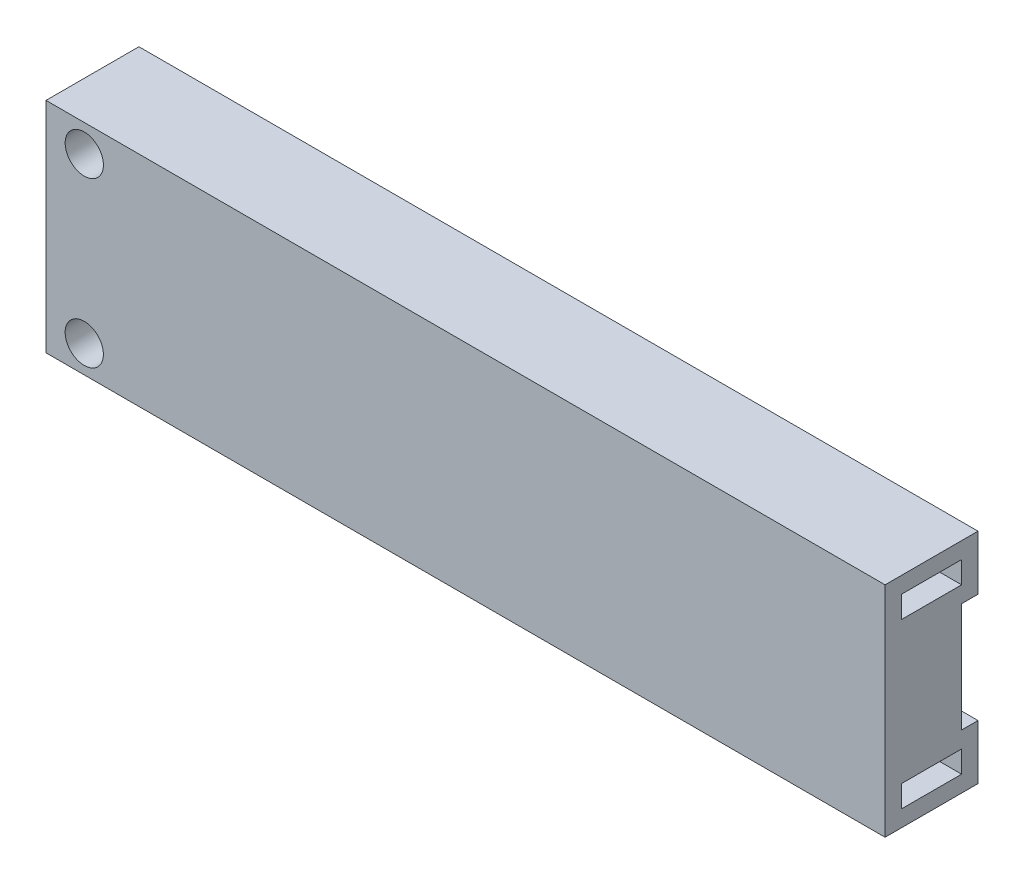
ISO-10303-21;
HEADER;
FILE_DESCRIPTION(('STEP AP214'),'2;1');
FILE_NAME('part.step','',(''),(''),'','','');
FILE_SCHEMA(('AUTOMOTIVE_DESIGN { 1 0 10303 214 1 1 1 1 }'));
ENDSEC;
DATA;
#1=APPLICATION_CONTEXT('core data for automotive mechanical design processes');
#2=APPLICATION_PROTOCOL_DEFINITION('international standard','automotive_design',2000,#1);
#3=PRODUCT_CONTEXT('',#1,'mechanical');
#4=PRODUCT('Part','Part','',(#3));
#5=PRODUCT_RELATED_PRODUCT_CATEGORY('part','',(#4));
#6=PRODUCT_DEFINITION_FORMATION('','',#4);
#7=PRODUCT_DEFINITION_CONTEXT('part definition',#1,'design');
#8=PRODUCT_DEFINITION('design','',#6,#7);
#9=PRODUCT_DEFINITION_SHAPE('','',#8);
#10=(LENGTH_UNIT() NAMED_UNIT(*) SI_UNIT(.MILLI.,.METRE.));
#11=(NAMED_UNIT(*) PLANE_ANGLE_UNIT() SI_UNIT($,.RADIAN.));
#12=(NAMED_UNIT(*) SI_UNIT($,.STERADIAN.) SOLID_ANGLE_UNIT());
#13=UNCERTAINTY_MEASURE_WITH_UNIT(LENGTH_MEASURE(1.E-05),#10,'distance_accuracy_value','');
#14=(GEOMETRIC_REPRESENTATION_CONTEXT(3) GLOBAL_UNCERTAINTY_ASSIGNED_CONTEXT((#13)) GLOBAL_UNIT_ASSIGNED_CONTEXT((#10,
#11,#12)) REPRESENTATION_CONTEXT('',''));
#15=CARTESIAN_POINT('',(0.,0.,0.));
#16=DIRECTION('',(0.,0.,1.));
#17=DIRECTION('',(1.,0.,0.));
#18=AXIS2_PLACEMENT_3D('',#15,#16,#17);
#19=CARTESIAN_POINT('',(0.,0.,0.));
#20=DIRECTION('',(0.,0.,-1.));
#21=DIRECTION('',(-1.,0.,0.));
#22=AXIS2_PLACEMENT_3D('',#19,#20,#21);
#23=PLANE('',#22);
#24=CARTESIAN_POINT('',(-83.,15.,0.));
#25=DIRECTION('',(0.,0.,-1.));
#26=DIRECTION('',(-1.,0.,0.));
#27=AXIS2_PLACEMENT_3D('',#24,#25,#26);
#28=CIRCLE('',#27,2.5);
#29=CARTESIAN_POINT('',(-85.5,15.,0.));
#30=VERTEX_POINT('',#29);
#31=EDGE_CURVE('E566',#30,#30,#28,.T.);
#32=ORIENTED_EDGE('',*,*,#31,.F.);
#33=EDGE_LOOP('',(#32));
#34=FACE_BOUND('',#33,.T.);
#35=CARTESIAN_POINT('',(-83.,-15.,0.));
#36=DIRECTION('',(0.,0.,-1.));
#37=DIRECTION('',(-1.,0.,0.));
#38=AXIS2_PLACEMENT_3D('',#35,#36,#37);
#39=CIRCLE('',#38,2.5);
#40=CARTESIAN_POINT('',(-85.5,-15.,0.));
#41=VERTEX_POINT('',#40);
#42=EDGE_CURVE('E552',#41,#41,#39,.T.);
#43=ORIENTED_EDGE('',*,*,#42,.F.);
#44=EDGE_LOOP('',(#43));
#45=FACE_BOUND('',#44,.T.);
#46=DIRECTION('',(-1.,0.,0.));
#47=VECTOR('',#46,1.);
#48=CARTESIAN_POINT('',(90.,20.,0.));
#49=LINE('',#48,#47);
#50=CARTESIAN_POINT('',(63.5,20.,0.));
#51=VERTEX_POINT('',#50);
#52=CARTESIAN_POINT('',(-90.,20.,0.));
#53=VERTEX_POINT('',#52);
#54=EDGE_CURVE('E539',#51,#53,#49,.T.);
#55=ORIENTED_EDGE('',*,*,#54,.F.);
#56=DIRECTION('',(0.,-1.,0.));
#57=VECTOR('',#56,1.);
#58=CARTESIAN_POINT('',(63.5,20.,0.));
#59=LINE('',#58,#57);
#60=CARTESIAN_POINT('',(63.5,10.,0.));
#61=VERTEX_POINT('',#60);
#62=EDGE_CURVE('E331',#51,#61,#59,.T.);
#63=ORIENTED_EDGE('',*,*,#62,.T.);
#64=DIRECTION('',(-1.,0.,0.));
#65=VECTOR('',#64,1.);
#66=CARTESIAN_POINT('',(0.,10.,0.));
#67=LINE('',#66,#65);
#68=CARTESIAN_POINT('',(-77.,10.,0.));
#69=VERTEX_POINT('',#68);
#70=EDGE_CURVE('E565',#61,#69,#67,.T.);
#71=ORIENTED_EDGE('',*,*,#70,.T.);
#72=DIRECTION('',(0.,-1.,0.));
#73=VECTOR('',#72,1.);
#74=CARTESIAN_POINT('',(-77.,0.,0.));
#75=LINE('',#74,#73);
#76=CARTESIAN_POINT('',(-77.,-10.,0.));
#77=VERTEX_POINT('',#76);
#78=EDGE_CURVE('E56',#69,#77,#75,.T.);
#79=ORIENTED_EDGE('',*,*,#78,.T.);
#80=DIRECTION('',(1.,0.,0.));
#81=VECTOR('',#80,1.);
#82=CARTESIAN_POINT('',(0.,-10.,0.));
#83=LINE('',#82,#81);
#84=CARTESIAN_POINT('',(63.5,-10.,0.));
#85=VERTEX_POINT('',#84);
#86=EDGE_CURVE('E11',#77,#85,#83,.T.);
#87=ORIENTED_EDGE('',*,*,#86,.T.);
#88=CARTESIAN_POINT('',(63.5,-20.,0.));
#89=VERTEX_POINT('',#88);
#90=EDGE_CURVE('E279',#85,#89,#59,.T.);
#91=ORIENTED_EDGE('',*,*,#90,.T.);
#92=DIRECTION('',(1.,0.,0.));
#93=VECTOR('',#92,1.);
#94=CARTESIAN_POINT('',(90.,-20.,0.));
#95=LINE('',#94,#93);
#96=CARTESIAN_POINT('',(-90.,-20.,0.));
#97=VERTEX_POINT('',#96);
#98=EDGE_CURVE('E551',#97,#89,#95,.T.);
#99=ORIENTED_EDGE('',*,*,#98,.F.);
#100=DIRECTION('',(0.,-1.,0.));
#101=VECTOR('',#100,1.);
#102=CARTESIAN_POINT('',(-90.,20.,0.));
#103=LINE('',#102,#101);
#104=EDGE_CURVE('E547',#53,#97,#103,.T.);
#105=ORIENTED_EDGE('',*,*,#104,.F.);
#106=EDGE_LOOP('',(#55,#63,#71,#79,#87,#91,#99,#105));
#107=FACE_BOUND('',#106,.T.);
#108=ADVANCED_FACE('F46',(#34,#45,#107),#23,.T.);
#109=CARTESIAN_POINT('',(90.,-20.,17.));
#110=DIRECTION('',(0.,1.,0.));
#111=DIRECTION('',(-1.,0.,0.));
#112=AXIS2_PLACEMENT_3D('',#109,#110,#111);
#113=PLANE('',#112);
#114=DIRECTION('',(0.,0.,-1.));
#115=VECTOR('',#114,1.);
#116=CARTESIAN_POINT('',(63.5,-20.,17.));
#117=LINE('',#116,#115);
#118=CARTESIAN_POINT('',(63.5,-20.,17.));
#119=VERTEX_POINT('',#118);
#120=EDGE_CURVE('E330',#119,#89,#117,.T.);
#121=ORIENTED_EDGE('',*,*,#120,.F.);
#122=DIRECTION('',(1.,0.,0.));
#123=VECTOR('',#122,1.);
#124=CARTESIAN_POINT('',(90.,-20.,17.));
#125=LINE('',#124,#123);
#126=CARTESIAN_POINT('',(-90.,-20.,17.));
#127=VERTEX_POINT('',#126);
#128=EDGE_CURVE('E538',#127,#119,#125,.T.);
#129=ORIENTED_EDGE('',*,*,#128,.F.);
#130=DIRECTION('',(0.,0.,-1.));
#131=VECTOR('',#130,1.);
#132=CARTESIAN_POINT('',(-90.,-20.,17.));
#133=LINE('',#132,#131);
#134=EDGE_CURVE('E561',#127,#97,#133,.T.);
#135=ORIENTED_EDGE('',*,*,#134,.T.);
#136=ORIENTED_EDGE('',*,*,#98,.T.);
#137=EDGE_LOOP('',(#121,#129,#135,#136));
#138=FACE_BOUND('',#137,.T.);
#139=ADVANCED_FACE('F621',(#138),#113,.F.);
#140=CARTESIAN_POINT('',(90.,20.,17.));
#141=DIRECTION('',(0.,-1.,0.));
#142=DIRECTION('',(1.,0.,0.));
#143=AXIS2_PLACEMENT_3D('',#140,#141,#142);
#144=PLANE('',#143);
#145=DIRECTION('',(0.,0.,-1.));
#146=VECTOR('',#145,1.);
#147=CARTESIAN_POINT('',(63.5,20.,17.));
#148=LINE('',#147,#146);
#149=CARTESIAN_POINT('',(63.5,20.,17.));
#150=VERTEX_POINT('',#149);
#151=EDGE_CURVE('E337',#150,#51,#148,.T.);
#152=ORIENTED_EDGE('',*,*,#151,.T.);
#153=ORIENTED_EDGE('',*,*,#54,.T.);
#154=DIRECTION('',(0.,0.,-1.));
#155=VECTOR('',#154,1.);
#156=CARTESIAN_POINT('',(-90.,20.,17.));
#157=LINE('',#156,#155);
#158=CARTESIAN_POINT('',(-90.,20.,17.));
#159=VERTEX_POINT('',#158);
#160=EDGE_CURVE('E546',#159,#53,#157,.T.);
#161=ORIENTED_EDGE('',*,*,#160,.F.);
#162=DIRECTION('',(-1.,0.,0.));
#163=VECTOR('',#162,1.);
#164=CARTESIAN_POINT('',(90.,20.,17.));
#165=LINE('',#164,#163);
#166=EDGE_CURVE('E543',#150,#159,#165,.T.);
#167=ORIENTED_EDGE('',*,*,#166,.F.);
#168=EDGE_LOOP('',(#152,#153,#161,#167));
#169=FACE_BOUND('',#168,.T.);
#170=ADVANCED_FACE('F629',(#169),#144,.F.);
#171=CARTESIAN_POINT('',(0.,0.,17.));
#172=DIRECTION('',(0.,0.,-1.));
#173=DIRECTION('',(-1.,0.,0.));
#174=AXIS2_PLACEMENT_3D('',#171,#172,#173);
#175=PLANE('',#174);
#176=CARTESIAN_POINT('',(-83.,15.,17.));
#177=DIRECTION('',(0.,0.,1.));
#178=DIRECTION('',(1.,0.,0.));
#179=AXIS2_PLACEMENT_3D('',#176,#177,#178);
#180=CIRCLE('',#179,3.50000000000001);
#181=CARTESIAN_POINT('',(-79.5,15.,17.));
#182=VERTEX_POINT('',#181);
#183=EDGE_CURVE('E521',#182,#182,#180,.T.);
#184=ORIENTED_EDGE('',*,*,#183,.F.);
#185=EDGE_LOOP('',(#184));
#186=FACE_BOUND('',#185,.T.);
#187=CARTESIAN_POINT('',(-83.,-15.,17.));
#188=DIRECTION('',(0.,0.,1.));
#189=DIRECTION('',(-1.,0.,0.));
#190=AXIS2_PLACEMENT_3D('',#187,#188,#189);
#191=CIRCLE('',#190,3.50000000000001);
#192=CARTESIAN_POINT('',(-86.5,-15.,17.));
#193=VERTEX_POINT('',#192);
#194=EDGE_CURVE('E517',#193,#193,#191,.T.);
#195=ORIENTED_EDGE('',*,*,#194,.F.);
#196=EDGE_LOOP('',(#195));
#197=FACE_BOUND('',#196,.T.);
#198=DIRECTION('',(0.,-1.,0.));
#199=VECTOR('',#198,1.);
#200=CARTESIAN_POINT('',(63.5,20.,17.));
#201=LINE('',#200,#199);
#202=EDGE_CURVE('E327',#150,#119,#201,.T.);
#203=ORIENTED_EDGE('',*,*,#202,.F.);
#204=ORIENTED_EDGE('',*,*,#166,.T.);
#205=DIRECTION('',(0.,-1.,0.));
#206=VECTOR('',#205,1.);
#207=CARTESIAN_POINT('',(-90.,20.,17.));
#208=LINE('',#207,#206);
#209=EDGE_CURVE('E534',#159,#127,#208,.T.);
#210=ORIENTED_EDGE('',*,*,#209,.T.);
#211=ORIENTED_EDGE('',*,*,#128,.T.);
#212=EDGE_LOOP('',(#203,#204,#210,#211));
#213=FACE_BOUND('',#212,.T.);
#214=ADVANCED_FACE('F710',(#186,#197,#213),#175,.F.);
#215=CARTESIAN_POINT('',(87.,10.,2.99999999999989));
#216=DIRECTION('',(0.,-1.,0.));
#217=DIRECTION('',(-1.,0.,0.));
#218=AXIS2_PLACEMENT_3D('',#215,#216,#217);
#219=PLANE('',#218);
#220=ORIENTED_EDGE('',*,*,#70,.F.);
#221=DIRECTION('',(0.,0.,1.));
#222=VECTOR('',#221,1.);
#223=CARTESIAN_POINT('',(63.5,10.,2.99999999999989));
#224=LINE('',#223,#222);
#225=CARTESIAN_POINT('',(63.5,10.,2.99999999999989));
#226=VERTEX_POINT('',#225);
#227=EDGE_CURVE('E344',#61,#226,#224,.T.);
#228=ORIENTED_EDGE('',*,*,#227,.T.);
#229=DIRECTION('',(1.,0.,0.));
#230=VECTOR('',#229,1.);
#231=CARTESIAN_POINT('',(77.,10.,2.99999999999989));
#232=LINE('',#231,#230);
#233=CARTESIAN_POINT('',(-77.,10.,2.99999999999989));
#234=VERTEX_POINT('',#233);
#235=EDGE_CURVE('E497',#234,#226,#232,.T.);
#236=ORIENTED_EDGE('',*,*,#235,.F.);
#237=DIRECTION('',(0.,0.,1.));
#238=VECTOR('',#237,1.);
#239=CARTESIAN_POINT('',(-77.,10.,-7.00000000000011));
#240=LINE('',#239,#238);
#241=EDGE_CURVE('E508',#69,#234,#240,.T.);
#242=ORIENTED_EDGE('',*,*,#241,.F.);
#243=EDGE_LOOP('',(#220,#228,#236,#242));
#244=FACE_BOUND('',#243,.T.);
#245=ADVANCED_FACE('F706',(#244),#219,.T.);
#246=CARTESIAN_POINT('',(87.,-10.,2.99999999999989));
#247=DIRECTION('',(0.,-1.,0.));
#248=DIRECTION('',(-1.,0.,0.));
#249=AXIS2_PLACEMENT_3D('',#246,#247,#248);
#250=PLANE('',#249);
#251=DIRECTION('',(0.,0.,1.));
#252=VECTOR('',#251,1.);
#253=CARTESIAN_POINT('',(63.5,-10.,2.99999999999989));
#254=LINE('',#253,#252);
#255=CARTESIAN_POINT('',(63.5,-10.,2.99999999999989));
#256=VERTEX_POINT('',#255);
#257=EDGE_CURVE('E341',#85,#256,#254,.T.);
#258=ORIENTED_EDGE('',*,*,#257,.F.);
#259=ORIENTED_EDGE('',*,*,#86,.F.);
#260=DIRECTION('',(0.,0.,1.));
#261=VECTOR('',#260,1.);
#262=CARTESIAN_POINT('',(-77.,-10.,-7.00000000000011));
#263=LINE('',#262,#261);
#264=CARTESIAN_POINT('',(-77.,-10.,2.99999999999989));
#265=VERTEX_POINT('',#264);
#266=EDGE_CURVE('E504',#77,#265,#263,.T.);
#267=ORIENTED_EDGE('',*,*,#266,.T.);
#268=DIRECTION('',(-1.,0.,0.));
#269=VECTOR('',#268,1.);
#270=CARTESIAN_POINT('',(77.,-10.,2.99999999999989));
#271=LINE('',#270,#269);
#272=EDGE_CURVE('E501',#256,#265,#271,.T.);
#273=ORIENTED_EDGE('',*,*,#272,.F.);
#274=EDGE_LOOP('',(#258,#259,#267,#273));
#275=FACE_BOUND('',#274,.T.);
#276=ADVANCED_FACE('F702',(#275),#250,.F.);
#277=CARTESIAN_POINT('',(-83.,15.,-1.));
#278=DIRECTION('',(0.,0.,1.));
#279=DIRECTION('',(1.,0.,0.));
#280=AXIS2_PLACEMENT_3D('',#277,#278,#279);
#281=CYLINDRICAL_SURFACE('',#280,2.5);
#282=ORIENTED_EDGE('',*,*,#31,.T.);
#283=EDGE_LOOP('',(#282));
#284=FACE_BOUND('',#283,.T.);
#285=CARTESIAN_POINT('',(-83.,15.,10.));
#286=DIRECTION('',(0.,0.,1.));
#287=DIRECTION('',(1.,0.,0.));
#288=AXIS2_PLACEMENT_3D('',#285,#286,#287);
#289=CIRCLE('',#288,2.5);
#290=CARTESIAN_POINT('',(-80.5,15.,10.));
#291=VERTEX_POINT('',#290);
#292=EDGE_CURVE('E570',#291,#291,#289,.F.);
#293=ORIENTED_EDGE('',*,*,#292,.F.);
#294=EDGE_LOOP('',(#293));
#295=FACE_BOUND('',#294,.T.);
#296=ADVANCED_FACE('F705',(#284,#295),#281,.F.);
#297=CARTESIAN_POINT('',(-90.,20.,17.));
#298=DIRECTION('',(1.,0.,0.));
#299=DIRECTION('',(0.,0.,-1.));
#300=AXIS2_PLACEMENT_3D('',#297,#298,#299);
#301=PLANE('',#300);
#302=ORIENTED_EDGE('',*,*,#104,.T.);
#303=ORIENTED_EDGE('',*,*,#134,.F.);
#304=ORIENTED_EDGE('',*,*,#209,.F.);
#305=ORIENTED_EDGE('',*,*,#160,.T.);
#306=EDGE_LOOP('',(#302,#303,#304,#305));
#307=FACE_BOUND('',#306,.T.);
#308=ADVANCED_FACE('F48',(#307),#301,.F.);
#309=CARTESIAN_POINT('',(-83.,-15.,-1.));
#310=DIRECTION('',(0.,0.,1.));
#311=DIRECTION('',(1.,0.,0.));
#312=AXIS2_PLACEMENT_3D('',#309,#310,#311);
#313=CYLINDRICAL_SURFACE('',#312,2.5);
#314=CARTESIAN_POINT('',(-83.,-15.,10.));
#315=DIRECTION('',(0.,0.,-1.));
#316=DIRECTION('',(-1.,0.,0.));
#317=AXIS2_PLACEMENT_3D('',#314,#315,#316);
#318=CIRCLE('',#317,2.5);
#319=CARTESIAN_POINT('',(-85.5,-15.,10.));
#320=VERTEX_POINT('',#319);
#321=EDGE_CURVE('E530',#320,#320,#318,.F.);
#322=ORIENTED_EDGE('',*,*,#321,.T.);
#323=EDGE_LOOP('',(#322));
#324=FACE_BOUND('',#323,.T.);
#325=ORIENTED_EDGE('',*,*,#42,.T.);
#326=EDGE_LOOP('',(#325));
#327=FACE_BOUND('',#326,.T.);
#328=ADVANCED_FACE('F724',(#324,#327),#313,.F.);
#329=CARTESIAN_POINT('',(-83.,-15.,10.));
#330=DIRECTION('',(0.,0.,-1.));
#331=DIRECTION('',(-1.,0.,0.));
#332=AXIS2_PLACEMENT_3D('',#329,#330,#331);
#333=PLANE('',#332);
#334=CARTESIAN_POINT('',(-83.,-15.,10.));
#335=DIRECTION('',(0.,0.,1.));
#336=DIRECTION('',(-1.,0.,0.));
#337=AXIS2_PLACEMENT_3D('',#334,#335,#336);
#338=CIRCLE('',#337,3.50000000000001);
#339=CARTESIAN_POINT('',(-86.5,-15.,10.));
#340=VERTEX_POINT('',#339);
#341=EDGE_CURVE('E522',#340,#340,#338,.T.);
#342=ORIENTED_EDGE('',*,*,#341,.T.);
#343=EDGE_LOOP('',(#342));
#344=FACE_BOUND('',#343,.T.);
#345=ORIENTED_EDGE('',*,*,#321,.F.);
#346=EDGE_LOOP('',(#345));
#347=FACE_BOUND('',#346,.T.);
#348=ADVANCED_FACE('F720',(#344,#347),#333,.F.);
#349=CARTESIAN_POINT('',(-83.,-15.,10.));
#350=DIRECTION('',(0.,0.,1.));
#351=DIRECTION('',(1.,0.,0.));
#352=AXIS2_PLACEMENT_3D('',#349,#350,#351);
#353=CYLINDRICAL_SURFACE('',#352,3.50000000000001);
#354=ORIENTED_EDGE('',*,*,#341,.F.);
#355=EDGE_LOOP('',(#354));
#356=FACE_BOUND('',#355,.T.);
#357=ORIENTED_EDGE('',*,*,#194,.T.);
#358=EDGE_LOOP('',(#357));
#359=FACE_BOUND('',#358,.T.);
#360=ADVANCED_FACE('F716',(#356,#359),#353,.F.);
#361=CARTESIAN_POINT('',(-83.,15.,10.));
#362=DIRECTION('',(0.,0.,1.));
#363=DIRECTION('',(1.,0.,0.));
#364=AXIS2_PLACEMENT_3D('',#361,#362,#363);
#365=PLANE('',#364);
#366=CARTESIAN_POINT('',(-83.,15.,10.));
#367=DIRECTION('',(0.,0.,1.));
#368=DIRECTION('',(1.,0.,0.));
#369=AXIS2_PLACEMENT_3D('',#366,#367,#368);
#370=CIRCLE('',#369,3.50000000000001);
#371=CARTESIAN_POINT('',(-79.5,15.,10.));
#372=VERTEX_POINT('',#371);
#373=EDGE_CURVE('E526',#372,#372,#370,.T.);
#374=ORIENTED_EDGE('',*,*,#373,.T.);
#375=EDGE_LOOP('',(#374));
#376=FACE_BOUND('',#375,.T.);
#377=ORIENTED_EDGE('',*,*,#292,.T.);
#378=EDGE_LOOP('',(#377));
#379=FACE_BOUND('',#378,.T.);
#380=ADVANCED_FACE('F719',(#376,#379),#365,.T.);
#381=CARTESIAN_POINT('',(-83.,15.,10.));
#382=DIRECTION('',(0.,0.,1.));
#383=DIRECTION('',(1.,0.,0.));
#384=AXIS2_PLACEMENT_3D('',#381,#382,#383);
#385=CYLINDRICAL_SURFACE('',#384,3.50000000000001);
#386=ORIENTED_EDGE('',*,*,#373,.F.);
#387=EDGE_LOOP('',(#386));
#388=FACE_BOUND('',#387,.T.);
#389=ORIENTED_EDGE('',*,*,#183,.T.);
#390=EDGE_LOOP('',(#389));
#391=FACE_BOUND('',#390,.T.);
#392=ADVANCED_FACE('F714',(#388,#391),#385,.F.);
#393=CARTESIAN_POINT('',(63.4999999999999,8.75,8.9999999999999));
#394=DIRECTION('',(1.,0.,0.));
#395=DIRECTION('',(0.,-1.,0.));
#396=AXIS2_PLACEMENT_3D('',#393,#394,#395);
#397=PLANE('',#396);
#398=DIRECTION('',(0.,-1.,0.));
#399=VECTOR('',#398,1.);
#400=CARTESIAN_POINT('',(63.4999999999999,17.,14.));
#401=LINE('',#400,#399);
#402=CARTESIAN_POINT('',(63.4999999999999,17.,14.));
#403=VERTEX_POINT('',#402);
#404=CARTESIAN_POINT('',(63.4999999999999,13.,14.));
#405=VERTEX_POINT('',#404);
#406=EDGE_CURVE('E64',#403,#405,#401,.T.);
#407=ORIENTED_EDGE('',*,*,#406,.F.);
#408=DIRECTION('',(0.,0.,1.));
#409=VECTOR('',#408,1.);
#410=CARTESIAN_POINT('',(63.4999999999999,17.,14.));
#411=LINE('',#410,#409);
#412=CARTESIAN_POINT('',(63.4999999999999,17.,3.));
#413=VERTEX_POINT('',#412);
#414=EDGE_CURVE('E257',#413,#403,#411,.T.);
#415=ORIENTED_EDGE('',*,*,#414,.F.);
#416=DIRECTION('',(0.,1.,0.));
#417=VECTOR('',#416,1.);
#418=CARTESIAN_POINT('',(63.4999999999999,17.,3.));
#419=LINE('',#418,#417);
#420=CARTESIAN_POINT('',(63.4999999999999,13.,3.));
#421=VERTEX_POINT('',#420);
#422=EDGE_CURVE('E261',#421,#413,#419,.T.);
#423=ORIENTED_EDGE('',*,*,#422,.F.);
#424=DIRECTION('',(0.,0.,-1.));
#425=VECTOR('',#424,1.);
#426=CARTESIAN_POINT('',(63.4999999999999,13.,14.));
#427=LINE('',#426,#425);
#428=EDGE_CURVE('E270',#405,#421,#427,.T.);
#429=ORIENTED_EDGE('',*,*,#428,.F.);
#430=EDGE_LOOP('',(#407,#415,#423,#429));
#431=FACE_BOUND('',#430,.T.);
#432=DIRECTION('',(0.,-1.,0.));
#433=VECTOR('',#432,1.);
#434=CARTESIAN_POINT('',(63.4999999999999,-17.,14.));
#435=LINE('',#434,#433);
#436=CARTESIAN_POINT('',(63.4999999999999,-13.,14.));
#437=VERTEX_POINT('',#436);
#438=CARTESIAN_POINT('',(63.4999999999999,-17.,14.));
#439=VERTEX_POINT('',#438);
#440=EDGE_CURVE('E72',#437,#439,#435,.T.);
#441=ORIENTED_EDGE('',*,*,#440,.F.);
#442=DIRECTION('',(0.,0.,1.));
#443=VECTOR('',#442,1.);
#444=CARTESIAN_POINT('',(63.4999999999999,-13.,14.));
#445=LINE('',#444,#443);
#446=CARTESIAN_POINT('',(63.4999999999999,-13.,3.));
#447=VERTEX_POINT('',#446);
#448=EDGE_CURVE('E298',#447,#437,#445,.T.);
#449=ORIENTED_EDGE('',*,*,#448,.F.);
#450=DIRECTION('',(0.,1.,0.));
#451=VECTOR('',#450,1.);
#452=CARTESIAN_POINT('',(63.4999999999999,-17.,2.99999999999999));
#453=LINE('',#452,#451);
#454=CARTESIAN_POINT('',(63.4999999999999,-17.,2.99999999999999));
#455=VERTEX_POINT('',#454);
#456=EDGE_CURVE('E302',#455,#447,#453,.T.);
#457=ORIENTED_EDGE('',*,*,#456,.F.);
#458=DIRECTION('',(0.,0.,-1.));
#459=VECTOR('',#458,1.);
#460=CARTESIAN_POINT('',(63.4999999999999,-17.,14.));
#461=LINE('',#460,#459);
#462=EDGE_CURVE('E307',#439,#455,#461,.T.);
#463=ORIENTED_EDGE('',*,*,#462,.F.);
#464=EDGE_LOOP('',(#441,#449,#457,#463));
#465=FACE_BOUND('',#464,.T.);
#466=DIRECTION('',(0.,-1.,0.));
#467=VECTOR('',#466,1.);
#468=CARTESIAN_POINT('',(63.5,0.,2.99999999999989));
#469=LINE('',#468,#467);
#470=EDGE_CURVE('E512',#226,#256,#469,.T.);
#471=ORIENTED_EDGE('',*,*,#470,.F.);
#472=ORIENTED_EDGE('',*,*,#227,.F.);
#473=ORIENTED_EDGE('',*,*,#62,.F.);
#474=ORIENTED_EDGE('',*,*,#151,.F.);
#475=ORIENTED_EDGE('',*,*,#202,.T.);
#476=ORIENTED_EDGE('',*,*,#120,.T.);
#477=ORIENTED_EDGE('',*,*,#90,.F.);
#478=ORIENTED_EDGE('',*,*,#257,.T.);
#479=EDGE_LOOP('',(#471,#472,#473,#474,#475,#476,#477,#478));
#480=FACE_BOUND('',#479,.T.);
#481=ADVANCED_FACE('F604',(#431,#465,#480),#397,.T.);
#482=CARTESIAN_POINT('',(0.,0.,2.99999999999989));
#483=DIRECTION('',(0.,0.,1.));
#484=DIRECTION('',(0.,1.,0.));
#485=AXIS2_PLACEMENT_3D('',#482,#483,#484);
#486=PLANE('',#485);
#487=DIRECTION('',(-1.,0.,0.));
#488=VECTOR('',#487,1.);
#489=CARTESIAN_POINT('',(-50.,-8.,2.99999999999989));
#490=LINE('',#489,#488);
#491=CARTESIAN_POINT('',(-19.5,-8.00000000000001,2.99999999999989));
#492=VERTEX_POINT('',#491);
#493=CARTESIAN_POINT('',(-50.,-8.,2.99999999999989));
#494=VERTEX_POINT('',#493);
#495=EDGE_CURVE('E383',#492,#494,#490,.T.);
#496=ORIENTED_EDGE('',*,*,#495,.F.);
#497=DIRECTION('',(0.,-1.,0.));
#498=VECTOR('',#497,1.);
#499=CARTESIAN_POINT('',(-19.5,-8.00000000000001,2.99999999999989));
#500=LINE('',#499,#498);
#501=CARTESIAN_POINT('',(-19.5,7.99999999999999,2.99999999999989));
#502=VERTEX_POINT('',#501);
#503=EDGE_CURVE('E378',#502,#492,#500,.T.);
#504=ORIENTED_EDGE('',*,*,#503,.F.);
#505=DIRECTION('',(1.,0.,0.));
#506=VECTOR('',#505,1.);
#507=CARTESIAN_POINT('',(-50.,8.,2.99999999999989));
#508=LINE('',#507,#506);
#509=CARTESIAN_POINT('',(-50.,8.,2.99999999999989));
#510=VERTEX_POINT('',#509);
#511=EDGE_CURVE('E374',#510,#502,#508,.T.);
#512=ORIENTED_EDGE('',*,*,#511,.F.);
#513=DIRECTION('',(0.,1.,0.));
#514=VECTOR('',#513,1.);
#515=CARTESIAN_POINT('',(-50.,8.,2.99999999999989));
#516=LINE('',#515,#514);
#517=EDGE_CURVE('E361',#494,#510,#516,.T.);
#518=ORIENTED_EDGE('',*,*,#517,.F.);
#519=EDGE_LOOP('',(#496,#504,#512,#518));
#520=FACE_BOUND('',#519,.T.);
#521=DIRECTION('',(1.,0.,0.));
#522=VECTOR('',#521,1.);
#523=CARTESIAN_POINT('',(25.,8.,2.99999999999989));
#524=LINE('',#523,#522);
#525=CARTESIAN_POINT('',(-5.5,8.,2.99999999999989));
#526=VERTEX_POINT('',#525);
#527=CARTESIAN_POINT('',(25.,8.,2.99999999999989));
#528=VERTEX_POINT('',#527);
#529=EDGE_CURVE('E409',#526,#528,#524,.T.);
#530=ORIENTED_EDGE('',*,*,#529,.F.);
#531=DIRECTION('',(0.,1.,0.));
#532=VECTOR('',#531,1.);
#533=CARTESIAN_POINT('',(-5.5,8.,2.99999999999989));
#534=LINE('',#533,#532);
#535=CARTESIAN_POINT('',(-5.5,-8.,2.99999999999989));
#536=VERTEX_POINT('',#535);
#537=EDGE_CURVE('E464',#536,#526,#534,.T.);
#538=ORIENTED_EDGE('',*,*,#537,.F.);
#539=DIRECTION('',(-1.,0.,0.));
#540=VECTOR('',#539,1.);
#541=CARTESIAN_POINT('',(25.,-8.,2.99999999999989));
#542=LINE('',#541,#540);
#543=CARTESIAN_POINT('',(25.,-8.,2.99999999999989));
#544=VERTEX_POINT('',#543);
#545=EDGE_CURVE('E468',#544,#536,#542,.T.);
#546=ORIENTED_EDGE('',*,*,#545,.F.);
#547=DIRECTION('',(0.,-1.,0.));
#548=VECTOR('',#547,1.);
#549=CARTESIAN_POINT('',(25.,8.,2.99999999999989));
#550=LINE('',#549,#548);
#551=EDGE_CURVE('E473',#528,#544,#550,.T.);
#552=ORIENTED_EDGE('',*,*,#551,.F.);
#553=EDGE_LOOP('',(#530,#538,#546,#552));
#554=FACE_BOUND('',#553,.T.);
#555=DIRECTION('',(0.,1.,0.));
#556=VECTOR('',#555,1.);
#557=CARTESIAN_POINT('',(-77.,-10.,2.99999999999989));
#558=LINE('',#557,#556);
#559=EDGE_CURVE('E403',#265,#234,#558,.T.);
#560=ORIENTED_EDGE('',*,*,#559,.T.);
#561=ORIENTED_EDGE('',*,*,#235,.T.);
#562=ORIENTED_EDGE('',*,*,#470,.T.);
#563=ORIENTED_EDGE('',*,*,#272,.T.);
#564=EDGE_LOOP('',(#560,#561,#562,#563));
#565=FACE_BOUND('',#564,.T.);
#566=DIRECTION('',(1.,0.,0.));
#567=VECTOR('',#566,1.);
#568=CARTESIAN_POINT('',(51.5,8.,2.99999999999989));
#569=LINE('',#568,#567);
#570=CARTESIAN_POINT('',(39.,8.,2.99999999999989));
#571=VERTEX_POINT('',#570);
#572=CARTESIAN_POINT('',(51.5,8.,2.99999999999989));
#573=VERTEX_POINT('',#572);
#574=EDGE_CURVE('E420',#571,#573,#569,.T.);
#575=ORIENTED_EDGE('',*,*,#574,.F.);
#576=DIRECTION('',(0.,1.,0.));
#577=VECTOR('',#576,1.);
#578=CARTESIAN_POINT('',(39.,8.,2.99999999999989));
#579=LINE('',#578,#577);
#580=CARTESIAN_POINT('',(39.,-8.,2.99999999999989));
#581=VERTEX_POINT('',#580);
#582=EDGE_CURVE('E424',#581,#571,#579,.T.);
#583=ORIENTED_EDGE('',*,*,#582,.F.);
#584=DIRECTION('',(-1.,0.,0.));
#585=VECTOR('',#584,1.);
#586=CARTESIAN_POINT('',(51.5,-8.,2.99999999999989));
#587=LINE('',#586,#585);
#588=CARTESIAN_POINT('',(51.5,-8.,2.99999999999989));
#589=VERTEX_POINT('',#588);
#590=EDGE_CURVE('E429',#589,#581,#587,.T.);
#591=ORIENTED_EDGE('',*,*,#590,.F.);
#592=DIRECTION('',(0.,-1.,0.));
#593=VECTOR('',#592,1.);
#594=CARTESIAN_POINT('',(51.5,8.,2.99999999999989));
#595=LINE('',#594,#593);
#596=EDGE_CURVE('E379',#573,#589,#595,.T.);
#597=ORIENTED_EDGE('',*,*,#596,.F.);
#598=EDGE_LOOP('',(#575,#583,#591,#597));
#599=FACE_BOUND('',#598,.T.);
#600=CARTESIAN_POINT('',(-67.,6.,2.99999999999989));
#601=DIRECTION('',(0.,0.,1.));
#602=DIRECTION('',(0.,1.,0.));
#603=AXIS2_PLACEMENT_3D('',#600,#601,#602);
#604=CIRCLE('',#603,2.5);
#605=CARTESIAN_POINT('',(-67.,8.5,2.99999999999989));
#606=VERTEX_POINT('',#605);
#607=EDGE_CURVE('E348',#606,#606,#604,.T.);
#608=ORIENTED_EDGE('',*,*,#607,.T.);
#609=EDGE_LOOP('',(#608));
#610=FACE_BOUND('',#609,.T.);
#611=CARTESIAN_POINT('',(-67.,-6.,2.99999999999989));
#612=DIRECTION('',(0.,0.,1.));
#613=DIRECTION('',(0.,-1.,0.));
#614=AXIS2_PLACEMENT_3D('',#611,#612,#613);
#615=CIRCLE('',#614,2.5);
#616=CARTESIAN_POINT('',(-67.,-8.5,2.99999999999989));
#617=VERTEX_POINT('',#616);
#618=EDGE_CURVE('E347',#617,#617,#615,.T.);
#619=ORIENTED_EDGE('',*,*,#618,.T.);
#620=EDGE_LOOP('',(#619));
#621=FACE_BOUND('',#620,.T.);
#622=ADVANCED_FACE('F598',(#520,#554,#565,#599,#610,#621),#486,.F.);
#623=CARTESIAN_POINT('',(-67.,6.,-4.00000000000011));
#624=DIRECTION('',(0.,0.,1.));
#625=DIRECTION('',(0.,1.,0.));
#626=AXIS2_PLACEMENT_3D('',#623,#624,#625);
#627=CYLINDRICAL_SURFACE('',#626,2.5);
#628=CARTESIAN_POINT('',(-67.,6.,0.));
#629=DIRECTION('',(0.,0.,-1.));
#630=DIRECTION('',(-1.,0.,0.));
#631=AXIS2_PLACEMENT_3D('',#628,#629,#630);
#632=CIRCLE('',#631,2.5);
#633=CARTESIAN_POINT('',(-69.5,6.,0.));
#634=VERTEX_POINT('',#633);
#635=EDGE_CURVE('E50',#634,#634,#632,.T.);
#636=ORIENTED_EDGE('',*,*,#635,.F.);
#637=EDGE_LOOP('',(#636));
#638=FACE_BOUND('',#637,.T.);
#639=ORIENTED_EDGE('',*,*,#607,.F.);
#640=EDGE_LOOP('',(#639));
#641=FACE_BOUND('',#640,.T.);
#642=ADVANCED_FACE('F594',(#638,#641),#627,.T.);
#643=CARTESIAN_POINT('',(-67.,-6.,-4.00000000000011));
#644=DIRECTION('',(0.,0.,1.));
#645=DIRECTION('',(0.,1.,0.));
#646=AXIS2_PLACEMENT_3D('',#643,#644,#645);
#647=CYLINDRICAL_SURFACE('',#646,2.5);
#648=CARTESIAN_POINT('',(-67.,-6.,0.));
#649=DIRECTION('',(0.,0.,-1.));
#650=DIRECTION('',(-1.,0.,0.));
#651=AXIS2_PLACEMENT_3D('',#648,#649,#650);
#652=CIRCLE('',#651,2.5);
#653=CARTESIAN_POINT('',(-69.5,-6.,0.));
#654=VERTEX_POINT('',#653);
#655=EDGE_CURVE('E516',#654,#654,#652,.T.);
#656=ORIENTED_EDGE('',*,*,#655,.F.);
#657=EDGE_LOOP('',(#656));
#658=FACE_BOUND('',#657,.T.);
#659=ORIENTED_EDGE('',*,*,#618,.F.);
#660=EDGE_LOOP('',(#659));
#661=FACE_BOUND('',#660,.T.);
#662=ADVANCED_FACE('F597',(#658,#661),#647,.T.);
#663=CARTESIAN_POINT('',(-77.,-10.,-7.00000000000011));
#664=DIRECTION('',(1.,0.,0.));
#665=DIRECTION('',(0.,-1.,0.));
#666=AXIS2_PLACEMENT_3D('',#663,#664,#665);
#667=PLANE('',#666);
#668=ORIENTED_EDGE('',*,*,#241,.T.);
#669=ORIENTED_EDGE('',*,*,#559,.F.);
#670=ORIENTED_EDGE('',*,*,#266,.F.);
#671=ORIENTED_EDGE('',*,*,#78,.F.);
#672=EDGE_LOOP('',(#668,#669,#670,#671));
#673=FACE_BOUND('',#672,.T.);
#674=ADVANCED_FACE('F610',(#673),#667,.T.);
#675=CARTESIAN_POINT('',(25.,8.,-1.0842021724855E-13));
#676=DIRECTION('',(0.,-1.,0.));
#677=DIRECTION('',(-1.,0.,0.));
#678=AXIS2_PLACEMENT_3D('',#675,#676,#677);
#679=PLANE('',#678);
#680=ORIENTED_EDGE('',*,*,#529,.T.);
#681=DIRECTION('',(0.,0.,1.));
#682=VECTOR('',#681,1.);
#683=CARTESIAN_POINT('',(25.,8.,-1.0842021724855E-13));
#684=LINE('',#683,#682);
#685=CARTESIAN_POINT('',(25.,8.,-1.0842021724855E-13));
#686=VERTEX_POINT('',#685);
#687=EDGE_CURVE('E352',#686,#528,#684,.T.);
#688=ORIENTED_EDGE('',*,*,#687,.F.);
#689=DIRECTION('',(1.,0.,0.));
#690=VECTOR('',#689,1.);
#691=CARTESIAN_POINT('',(25.,8.,-1.0842021724855E-13));
#692=LINE('',#691,#690);
#693=CARTESIAN_POINT('',(-5.5,8.,0.));
#694=VERTEX_POINT('',#693);
#695=EDGE_CURVE('E469',#694,#686,#692,.T.);
#696=ORIENTED_EDGE('',*,*,#695,.F.);
#697=DIRECTION('',(0.,0.,1.));
#698=VECTOR('',#697,1.);
#699=CARTESIAN_POINT('',(-5.5,8.,-1.0842021724855E-13));
#700=LINE('',#699,#698);
#701=EDGE_CURVE('E459',#694,#526,#700,.T.);
#702=ORIENTED_EDGE('',*,*,#701,.T.);
#703=EDGE_LOOP('',(#680,#688,#696,#702));
#704=FACE_BOUND('',#703,.T.);
#705=ADVANCED_FACE('F616',(#704),#679,.F.);
#706=CARTESIAN_POINT('',(25.,8.,-1.0842021724855E-13));
#707=DIRECTION('',(-1.,0.,0.));
#708=DIRECTION('',(0.,1.,0.));
#709=AXIS2_PLACEMENT_3D('',#706,#707,#708);
#710=PLANE('',#709);
#711=ORIENTED_EDGE('',*,*,#551,.T.);
#712=DIRECTION('',(0.,0.,1.));
#713=VECTOR('',#712,1.);
#714=CARTESIAN_POINT('',(25.,-8.,-1.0842021724855E-13));
#715=LINE('',#714,#713);
#716=CARTESIAN_POINT('',(25.,-8.,-1.0842021724855E-13));
#717=VERTEX_POINT('',#716);
#718=EDGE_CURVE('E453',#717,#544,#715,.T.);
#719=ORIENTED_EDGE('',*,*,#718,.F.);
#720=DIRECTION('',(0.,-1.,0.));
#721=VECTOR('',#720,1.);
#722=CARTESIAN_POINT('',(25.,8.,-1.0842021724855E-13));
#723=LINE('',#722,#721);
#724=EDGE_CURVE('E487',#686,#717,#723,.T.);
#725=ORIENTED_EDGE('',*,*,#724,.F.);
#726=ORIENTED_EDGE('',*,*,#687,.T.);
#727=EDGE_LOOP('',(#711,#719,#725,#726));
#728=FACE_BOUND('',#727,.T.);
#729=ADVANCED_FACE('F690',(#728),#710,.F.);
#730=CARTESIAN_POINT('',(25.,-8.,-1.0842021724855E-13));
#731=DIRECTION('',(0.,1.,0.));
#732=DIRECTION('',(1.,0.,0.));
#733=AXIS2_PLACEMENT_3D('',#730,#731,#732);
#734=PLANE('',#733);
#735=ORIENTED_EDGE('',*,*,#545,.T.);
#736=DIRECTION('',(0.,0.,1.));
#737=VECTOR('',#736,1.);
#738=CARTESIAN_POINT('',(-5.5,-8.,-1.0842021724855E-13));
#739=LINE('',#738,#737);
#740=CARTESIAN_POINT('',(-5.5,-8.,-1.0842021724855E-13));
#741=VERTEX_POINT('',#740);
#742=EDGE_CURVE('E456',#741,#536,#739,.T.);
#743=ORIENTED_EDGE('',*,*,#742,.F.);
#744=DIRECTION('',(-1.,0.,0.));
#745=VECTOR('',#744,1.);
#746=CARTESIAN_POINT('',(25.,-8.,-1.0842021724855E-13));
#747=LINE('',#746,#745);
#748=EDGE_CURVE('E483',#717,#741,#747,.T.);
#749=ORIENTED_EDGE('',*,*,#748,.F.);
#750=ORIENTED_EDGE('',*,*,#718,.T.);
#751=EDGE_LOOP('',(#735,#743,#749,#750));
#752=FACE_BOUND('',#751,.T.);
#753=ADVANCED_FACE('F694',(#752),#734,.F.);
#754=CARTESIAN_POINT('',(-5.5,8.,-1.0842021724855E-13));
#755=DIRECTION('',(1.,0.,0.));
#756=DIRECTION('',(0.,-1.,0.));
#757=AXIS2_PLACEMENT_3D('',#754,#755,#756);
#758=PLANE('',#757);
#759=ORIENTED_EDGE('',*,*,#537,.T.);
#760=ORIENTED_EDGE('',*,*,#701,.F.);
#761=DIRECTION('',(0.,1.,0.));
#762=VECTOR('',#761,1.);
#763=CARTESIAN_POINT('',(-5.5,8.,-1.0842021724855E-13));
#764=LINE('',#763,#762);
#765=EDGE_CURVE('E463',#741,#694,#764,.T.);
#766=ORIENTED_EDGE('',*,*,#765,.F.);
#767=ORIENTED_EDGE('',*,*,#742,.T.);
#768=EDGE_LOOP('',(#759,#760,#766,#767));
#769=FACE_BOUND('',#768,.T.);
#770=ADVANCED_FACE('F676',(#769),#758,.F.);
#771=CARTESIAN_POINT('',(51.5,8.,-1.0842021724855E-13));
#772=DIRECTION('',(-1.,0.,0.));
#773=DIRECTION('',(0.,1.,0.));
#774=AXIS2_PLACEMENT_3D('',#771,#772,#773);
#775=PLANE('',#774);
#776=ORIENTED_EDGE('',*,*,#596,.T.);
#777=DIRECTION('',(0.,0.,1.));
#778=VECTOR('',#777,1.);
#779=CARTESIAN_POINT('',(51.5,-8.,-1.0842021724855E-13));
#780=LINE('',#779,#778);
#781=CARTESIAN_POINT('',(51.5,-8.,-1.0842021724855E-13));
#782=VERTEX_POINT('',#781);
#783=EDGE_CURVE('E404',#782,#589,#780,.T.);
#784=ORIENTED_EDGE('',*,*,#783,.F.);
#785=DIRECTION('',(0.,-1.,0.));
#786=VECTOR('',#785,1.);
#787=CARTESIAN_POINT('',(51.5,8.,-1.0842021724855E-13));
#788=LINE('',#787,#786);
#789=CARTESIAN_POINT('',(51.5,8.,0.));
#790=VERTEX_POINT('',#789);
#791=EDGE_CURVE('E425',#790,#782,#788,.T.);
#792=ORIENTED_EDGE('',*,*,#791,.F.);
#793=DIRECTION('',(0.,0.,1.));
#794=VECTOR('',#793,1.);
#795=CARTESIAN_POINT('',(51.5,8.,-1.0842021724855E-13));
#796=LINE('',#795,#794);
#797=EDGE_CURVE('E415',#790,#573,#796,.T.);
#798=ORIENTED_EDGE('',*,*,#797,.T.);
#799=EDGE_LOOP('',(#776,#784,#792,#798));
#800=FACE_BOUND('',#799,.T.);
#801=ADVANCED_FACE('F672',(#800),#775,.F.);
#802=CARTESIAN_POINT('',(51.5,-8.,-1.0842021724855E-13));
#803=DIRECTION('',(0.,1.,0.));
#804=DIRECTION('',(1.,0.,0.));
#805=AXIS2_PLACEMENT_3D('',#802,#803,#804);
#806=PLANE('',#805);
#807=ORIENTED_EDGE('',*,*,#590,.T.);
#808=DIRECTION('',(0.,0.,1.));
#809=VECTOR('',#808,1.);
#810=CARTESIAN_POINT('',(39.,-8.,-1.0842021724855E-13));
#811=LINE('',#810,#809);
#812=CARTESIAN_POINT('',(39.,-8.,-1.0842021724855E-13));
#813=VERTEX_POINT('',#812);
#814=EDGE_CURVE('E408',#813,#581,#811,.T.);
#815=ORIENTED_EDGE('',*,*,#814,.F.);
#816=DIRECTION('',(-1.,0.,0.));
#817=VECTOR('',#816,1.);
#818=CARTESIAN_POINT('',(51.5,-8.,-1.0842021724855E-13));
#819=LINE('',#818,#817);
#820=EDGE_CURVE('E443',#782,#813,#819,.T.);
#821=ORIENTED_EDGE('',*,*,#820,.F.);
#822=ORIENTED_EDGE('',*,*,#783,.T.);
#823=EDGE_LOOP('',(#807,#815,#821,#822));
#824=FACE_BOUND('',#823,.T.);
#825=ADVANCED_FACE('F675',(#824),#806,.F.);
#826=CARTESIAN_POINT('',(39.,8.,-1.0842021724855E-13));
#827=DIRECTION('',(1.,0.,0.));
#828=DIRECTION('',(0.,-1.,0.));
#829=AXIS2_PLACEMENT_3D('',#826,#827,#828);
#830=PLANE('',#829);
#831=ORIENTED_EDGE('',*,*,#582,.T.);
#832=DIRECTION('',(0.,0.,1.));
#833=VECTOR('',#832,1.);
#834=CARTESIAN_POINT('',(39.,8.,-1.0842021724855E-13));
#835=LINE('',#834,#833);
#836=CARTESIAN_POINT('',(39.,8.,-1.0842021724855E-13));
#837=VERTEX_POINT('',#836);
#838=EDGE_CURVE('E412',#837,#571,#835,.T.);
#839=ORIENTED_EDGE('',*,*,#838,.F.);
#840=DIRECTION('',(0.,1.,0.));
#841=VECTOR('',#840,1.);
#842=CARTESIAN_POINT('',(39.,8.,-1.0842021724855E-13));
#843=LINE('',#842,#841);
#844=EDGE_CURVE('E439',#813,#837,#843,.T.);
#845=ORIENTED_EDGE('',*,*,#844,.F.);
#846=ORIENTED_EDGE('',*,*,#814,.T.);
#847=EDGE_LOOP('',(#831,#839,#845,#846));
#848=FACE_BOUND('',#847,.T.);
#849=ADVANCED_FACE('F680',(#848),#830,.F.);
#850=CARTESIAN_POINT('',(51.5,8.,-1.0842021724855E-13));
#851=DIRECTION('',(0.,-1.,0.));
#852=DIRECTION('',(-1.,0.,0.));
#853=AXIS2_PLACEMENT_3D('',#850,#851,#852);
#854=PLANE('',#853);
#855=ORIENTED_EDGE('',*,*,#574,.T.);
#856=ORIENTED_EDGE('',*,*,#797,.F.);
#857=DIRECTION('',(1.,0.,0.));
#858=VECTOR('',#857,1.);
#859=CARTESIAN_POINT('',(51.5,8.,-1.0842021724855E-13));
#860=LINE('',#859,#858);
#861=EDGE_CURVE('E419',#837,#790,#860,.T.);
#862=ORIENTED_EDGE('',*,*,#861,.F.);
#863=ORIENTED_EDGE('',*,*,#838,.T.);
#864=EDGE_LOOP('',(#855,#856,#862,#863));
#865=FACE_BOUND('',#864,.T.);
#866=ADVANCED_FACE('F669',(#865),#854,.F.);
#867=CARTESIAN_POINT('',(-50.,8.,-1.0842021724855E-13));
#868=DIRECTION('',(0.,-1.,0.));
#869=DIRECTION('',(-1.,0.,0.));
#870=AXIS2_PLACEMENT_3D('',#867,#868,#869);
#871=PLANE('',#870);
#872=ORIENTED_EDGE('',*,*,#511,.T.);
#873=DIRECTION('',(0.,0.,1.));
#874=VECTOR('',#873,1.);
#875=CARTESIAN_POINT('',(-19.5,7.99999999999999,-1.0842021724855E-13));
#876=LINE('',#875,#874);
#877=CARTESIAN_POINT('',(-19.5,7.99999999999999,-1.0842021724855E-13));
#878=VERTEX_POINT('',#877);
#879=EDGE_CURVE('E399',#878,#502,#876,.T.);
#880=ORIENTED_EDGE('',*,*,#879,.F.);
#881=DIRECTION('',(1.,0.,0.));
#882=VECTOR('',#881,1.);
#883=CARTESIAN_POINT('',(-50.,8.,-1.0842021724855E-13));
#884=LINE('',#883,#882);
#885=CARTESIAN_POINT('',(-50.,8.,0.));
#886=VERTEX_POINT('',#885);
#887=EDGE_CURVE('E356',#886,#878,#884,.T.);
#888=ORIENTED_EDGE('',*,*,#887,.F.);
#889=DIRECTION('',(0.,0.,1.));
#890=VECTOR('',#889,1.);
#891=CARTESIAN_POINT('',(-50.,8.,-1.0842021724855E-13));
#892=LINE('',#891,#890);
#893=EDGE_CURVE('E373',#886,#510,#892,.T.);
#894=ORIENTED_EDGE('',*,*,#893,.T.);
#895=EDGE_LOOP('',(#872,#880,#888,#894));
#896=FACE_BOUND('',#895,.T.);
#897=ADVANCED_FACE('F654',(#896),#871,.F.);
#898=CARTESIAN_POINT('',(-19.5,-8.00000000000001,-1.0842021724855E-13));
#899=DIRECTION('',(-1.,0.,0.));
#900=DIRECTION('',(0.,1.,0.));
#901=AXIS2_PLACEMENT_3D('',#898,#899,#900);
#902=PLANE('',#901);
#903=ORIENTED_EDGE('',*,*,#503,.T.);
#904=DIRECTION('',(0.,0.,1.));
#905=VECTOR('',#904,1.);
#906=CARTESIAN_POINT('',(-19.5,-8.00000000000001,-1.0842021724855E-13));
#907=LINE('',#906,#905);
#908=CARTESIAN_POINT('',(-19.5,-8.00000000000001,-1.0842021724855E-13));
#909=VERTEX_POINT('',#908);
#910=EDGE_CURVE('E396',#909,#492,#907,.T.);
#911=ORIENTED_EDGE('',*,*,#910,.F.);
#912=DIRECTION('',(0.,-1.,0.));
#913=VECTOR('',#912,1.);
#914=CARTESIAN_POINT('',(-19.5,-8.00000000000001,-1.0842021724855E-13));
#915=LINE('',#914,#913);
#916=EDGE_CURVE('E360',#878,#909,#915,.T.);
#917=ORIENTED_EDGE('',*,*,#916,.F.);
#918=ORIENTED_EDGE('',*,*,#879,.T.);
#919=EDGE_LOOP('',(#903,#911,#917,#918));
#920=FACE_BOUND('',#919,.T.);
#921=ADVANCED_FACE('F661',(#920),#902,.F.);
#922=CARTESIAN_POINT('',(-50.,-8.,-1.0842021724855E-13));
#923=DIRECTION('',(0.,1.,0.));
#924=DIRECTION('',(1.,0.,0.));
#925=AXIS2_PLACEMENT_3D('',#922,#923,#924);
#926=PLANE('',#925);
#927=ORIENTED_EDGE('',*,*,#495,.T.);
#928=DIRECTION('',(0.,0.,1.));
#929=VECTOR('',#928,1.);
#930=CARTESIAN_POINT('',(-50.,-8.,-1.0842021724855E-13));
#931=LINE('',#930,#929);
#932=CARTESIAN_POINT('',(-50.,-8.,-1.0842021724855E-13));
#933=VERTEX_POINT('',#932);
#934=EDGE_CURVE('E393',#933,#494,#931,.T.);
#935=ORIENTED_EDGE('',*,*,#934,.F.);
#936=DIRECTION('',(-1.,0.,0.));
#937=VECTOR('',#936,1.);
#938=CARTESIAN_POINT('',(-50.,-8.,-1.0842021724855E-13));
#939=LINE('',#938,#937);
#940=EDGE_CURVE('E365',#909,#933,#939,.T.);
#941=ORIENTED_EDGE('',*,*,#940,.F.);
#942=ORIENTED_EDGE('',*,*,#910,.T.);
#943=EDGE_LOOP('',(#927,#935,#941,#942));
#944=FACE_BOUND('',#943,.T.);
#945=ADVANCED_FACE('F648',(#944),#926,.F.);
#946=CARTESIAN_POINT('',(-50.,8.,-1.0842021724855E-13));
#947=DIRECTION('',(1.,0.,0.));
#948=DIRECTION('',(0.,-1.,0.));
#949=AXIS2_PLACEMENT_3D('',#946,#947,#948);
#950=PLANE('',#949);
#951=ORIENTED_EDGE('',*,*,#517,.T.);
#952=ORIENTED_EDGE('',*,*,#893,.F.);
#953=DIRECTION('',(0.,1.,0.));
#954=VECTOR('',#953,1.);
#955=CARTESIAN_POINT('',(-50.,8.,-1.0842021724855E-13));
#956=LINE('',#955,#954);
#957=EDGE_CURVE('E369',#933,#886,#956,.T.);
#958=ORIENTED_EDGE('',*,*,#957,.F.);
#959=ORIENTED_EDGE('',*,*,#934,.T.);
#960=EDGE_LOOP('',(#951,#952,#958,#959));
#961=FACE_BOUND('',#960,.T.);
#962=ADVANCED_FACE('F640',(#961),#950,.F.);
#963=ORIENTED_EDGE('',*,*,#887,.T.);
#964=ORIENTED_EDGE('',*,*,#916,.T.);
#965=ORIENTED_EDGE('',*,*,#940,.T.);
#966=ORIENTED_EDGE('',*,*,#957,.T.);
#967=EDGE_LOOP('',(#963,#964,#965,#966));
#968=FACE_BOUND('',#967,.T.);
#969=ADVANCED_FACE('F624',(#968),#23,.T.);
#970=ORIENTED_EDGE('',*,*,#791,.T.);
#971=ORIENTED_EDGE('',*,*,#820,.T.);
#972=ORIENTED_EDGE('',*,*,#844,.T.);
#973=ORIENTED_EDGE('',*,*,#861,.T.);
#974=EDGE_LOOP('',(#970,#971,#972,#973));
#975=FACE_BOUND('',#974,.T.);
#976=ADVANCED_FACE('F639',(#975),#23,.T.);
#977=ORIENTED_EDGE('',*,*,#695,.T.);
#978=ORIENTED_EDGE('',*,*,#724,.T.);
#979=ORIENTED_EDGE('',*,*,#748,.T.);
#980=ORIENTED_EDGE('',*,*,#765,.T.);
#981=EDGE_LOOP('',(#977,#978,#979,#980));
#982=FACE_BOUND('',#981,.T.);
#983=ADVANCED_FACE('F646',(#982),#23,.T.);
#984=ORIENTED_EDGE('',*,*,#655,.T.);
#985=EDGE_LOOP('',(#984));
#986=FACE_BOUND('',#985,.T.);
#987=ADVANCED_FACE('F637',(#986),#23,.T.);
#988=ORIENTED_EDGE('',*,*,#635,.T.);
#989=EDGE_LOOP('',(#988));
#990=FACE_BOUND('',#989,.T.);
#991=ADVANCED_FACE('F592',(#990),#23,.T.);
#992=CARTESIAN_POINT('',(56.4999999999999,-17.,14.));
#993=DIRECTION('',(0.,0.,1.));
#994=DIRECTION('',(1.,0.,0.));
#995=AXIS2_PLACEMENT_3D('',#992,#993,#994);
#996=PLANE('',#995);
#997=ORIENTED_EDGE('',*,*,#440,.T.);
#998=DIRECTION('',(1.,0.,0.));
#999=VECTOR('',#998,1.);
#1000=CARTESIAN_POINT('',(56.4999999999999,-17.,14.));
#1001=LINE('',#1000,#999);
#1002=CARTESIAN_POINT('',(56.4999999999999,-17.,14.));
#1003=VERTEX_POINT('',#1002);
#1004=EDGE_CURVE('E285',#1003,#439,#1001,.T.);
#1005=ORIENTED_EDGE('',*,*,#1004,.F.);
#1006=DIRECTION('',(0.,-1.,0.));
#1007=VECTOR('',#1006,1.);
#1008=CARTESIAN_POINT('',(56.4999999999999,-17.,14.));
#1009=LINE('',#1008,#1007);
#1010=CARTESIAN_POINT('',(56.4999999999999,-13.,14.));
#1011=VERTEX_POINT('',#1010);
#1012=EDGE_CURVE('E303',#1011,#1003,#1009,.T.);
#1013=ORIENTED_EDGE('',*,*,#1012,.F.);
#1014=DIRECTION('',(1.,0.,0.));
#1015=VECTOR('',#1014,1.);
#1016=CARTESIAN_POINT('',(56.4999999999999,-13.,14.));
#1017=LINE('',#1016,#1015);
#1018=EDGE_CURVE('E295',#1011,#437,#1017,.T.);
#1019=ORIENTED_EDGE('',*,*,#1018,.T.);
#1020=EDGE_LOOP('',(#997,#1005,#1013,#1019));
#1021=FACE_BOUND('',#1020,.T.);
#1022=ADVANCED_FACE('F636',(#1021),#996,.F.);
#1023=CARTESIAN_POINT('',(56.4999999999999,-13.,14.));
#1024=DIRECTION('',(0.,1.,0.));
#1025=DIRECTION('',(0.,0.,1.));
#1026=AXIS2_PLACEMENT_3D('',#1023,#1024,#1025);
#1027=PLANE('',#1026);
#1028=ORIENTED_EDGE('',*,*,#448,.T.);
#1029=ORIENTED_EDGE('',*,*,#1018,.F.);
#1030=DIRECTION('',(0.,0.,1.));
#1031=VECTOR('',#1030,1.);
#1032=CARTESIAN_POINT('',(56.4999999999999,-13.,14.));
#1033=LINE('',#1032,#1031);
#1034=CARTESIAN_POINT('',(56.4999999999999,-13.,3.));
#1035=VERTEX_POINT('',#1034);
#1036=EDGE_CURVE('E288',#1035,#1011,#1033,.T.);
#1037=ORIENTED_EDGE('',*,*,#1036,.F.);
#1038=DIRECTION('',(1.,0.,0.));
#1039=VECTOR('',#1038,1.);
#1040=CARTESIAN_POINT('',(56.4999999999999,-13.,3.));
#1041=LINE('',#1040,#1039);
#1042=EDGE_CURVE('E292',#1035,#447,#1041,.T.);
#1043=ORIENTED_EDGE('',*,*,#1042,.T.);
#1044=EDGE_LOOP('',(#1028,#1029,#1037,#1043));
#1045=FACE_BOUND('',#1044,.T.);
#1046=ADVANCED_FACE('F1001',(#1045),#1027,.F.);
#1047=CARTESIAN_POINT('',(56.4999999999999,-17.,2.99999999999999));
#1048=DIRECTION('',(0.,0.,-1.));
#1049=DIRECTION('',(0.,1.,0.));
#1050=AXIS2_PLACEMENT_3D('',#1047,#1048,#1049);
#1051=PLANE('',#1050);
#1052=ORIENTED_EDGE('',*,*,#456,.T.);
#1053=ORIENTED_EDGE('',*,*,#1042,.F.);
#1054=DIRECTION('',(0.,1.,0.));
#1055=VECTOR('',#1054,1.);
#1056=CARTESIAN_POINT('',(56.4999999999999,-17.,2.99999999999999));
#1057=LINE('',#1056,#1055);
#1058=CARTESIAN_POINT('',(56.4999999999999,-17.,2.99999999999999));
#1059=VERTEX_POINT('',#1058);
#1060=EDGE_CURVE('E316',#1059,#1035,#1057,.T.);
#1061=ORIENTED_EDGE('',*,*,#1060,.F.);
#1062=DIRECTION('',(1.,0.,0.));
#1063=VECTOR('',#1062,1.);
#1064=CARTESIAN_POINT('',(56.4999999999999,-17.,2.99999999999999));
#1065=LINE('',#1064,#1063);
#1066=EDGE_CURVE('E289',#1059,#455,#1065,.T.);
#1067=ORIENTED_EDGE('',*,*,#1066,.T.);
#1068=EDGE_LOOP('',(#1052,#1053,#1061,#1067));
#1069=FACE_BOUND('',#1068,.T.);
#1070=ADVANCED_FACE('F1010',(#1069),#1051,.F.);
#1071=CARTESIAN_POINT('',(56.4999999999999,-17.,14.));
#1072=DIRECTION('',(0.,-1.,0.));
#1073=DIRECTION('',(1.,0.,0.));
#1074=AXIS2_PLACEMENT_3D('',#1071,#1072,#1073);
#1075=PLANE('',#1074);
#1076=ORIENTED_EDGE('',*,*,#462,.T.);
#1077=ORIENTED_EDGE('',*,*,#1066,.F.);
#1078=DIRECTION('',(0.,0.,-1.));
#1079=VECTOR('',#1078,1.);
#1080=CARTESIAN_POINT('',(56.4999999999999,-17.,14.));
#1081=LINE('',#1080,#1079);
#1082=EDGE_CURVE('E320',#1003,#1059,#1081,.T.);
#1083=ORIENTED_EDGE('',*,*,#1082,.F.);
#1084=ORIENTED_EDGE('',*,*,#1004,.T.);
#1085=EDGE_LOOP('',(#1076,#1077,#1083,#1084));
#1086=FACE_BOUND('',#1085,.T.);
#1087=ADVANCED_FACE('F1020',(#1086),#1075,.F.);
#1088=CARTESIAN_POINT('',(56.4999999999999,0.,0.));
#1089=DIRECTION('',(-1.,0.,0.));
#1090=DIRECTION('',(0.,0.,1.));
#1091=AXIS2_PLACEMENT_3D('',#1088,#1089,#1090);
#1092=PLANE('',#1091);
#1093=ORIENTED_EDGE('',*,*,#1012,.T.);
#1094=ORIENTED_EDGE('',*,*,#1082,.T.);
#1095=ORIENTED_EDGE('',*,*,#1060,.T.);
#1096=ORIENTED_EDGE('',*,*,#1036,.T.);
#1097=EDGE_LOOP('',(#1093,#1094,#1095,#1096));
#1098=FACE_BOUND('',#1097,.T.);
#1099=ADVANCED_FACE('F1030',(#1098),#1092,.F.);
#1100=CARTESIAN_POINT('',(56.4999999999999,17.,14.));
#1101=DIRECTION('',(0.,0.,1.));
#1102=DIRECTION('',(1.,0.,0.));
#1103=AXIS2_PLACEMENT_3D('',#1100,#1101,#1102);
#1104=PLANE('',#1103);
#1105=ORIENTED_EDGE('',*,*,#406,.T.);
#1106=DIRECTION('',(1.,0.,0.));
#1107=VECTOR('',#1106,1.);
#1108=CARTESIAN_POINT('',(56.4999999999999,13.,14.));
#1109=LINE('',#1108,#1107);
#1110=CARTESIAN_POINT('',(56.4999999999999,13.,14.));
#1111=VERTEX_POINT('',#1110);
#1112=EDGE_CURVE('E232',#1111,#405,#1109,.T.);
#1113=ORIENTED_EDGE('',*,*,#1112,.F.);
#1114=DIRECTION('',(0.,-1.,0.));
#1115=VECTOR('',#1114,1.);
#1116=CARTESIAN_POINT('',(56.4999999999999,17.,14.));
#1117=LINE('',#1116,#1115);
#1118=CARTESIAN_POINT('',(56.4999999999999,17.,14.));
#1119=VERTEX_POINT('',#1118);
#1120=EDGE_CURVE('E236',#1119,#1111,#1117,.T.);
#1121=ORIENTED_EDGE('',*,*,#1120,.F.);
#1122=DIRECTION('',(1.,0.,0.));
#1123=VECTOR('',#1122,1.);
#1124=CARTESIAN_POINT('',(56.4999999999999,17.,14.));
#1125=LINE('',#1124,#1123);
#1126=EDGE_CURVE('E276',#1119,#403,#1125,.T.);
#1127=ORIENTED_EDGE('',*,*,#1126,.T.);
#1128=EDGE_LOOP('',(#1105,#1113,#1121,#1127));
#1129=FACE_BOUND('',#1128,.T.);
#1130=ADVANCED_FACE('F234',(#1129),#1104,.F.);
#1131=CARTESIAN_POINT('',(56.4999999999999,17.,14.));
#1132=DIRECTION('',(0.,1.,0.));
#1133=DIRECTION('',(-1.,0.,0.));
#1134=AXIS2_PLACEMENT_3D('',#1131,#1132,#1133);
#1135=PLANE('',#1134);
#1136=ORIENTED_EDGE('',*,*,#414,.T.);
#1137=ORIENTED_EDGE('',*,*,#1126,.F.);
#1138=DIRECTION('',(0.,0.,1.));
#1139=VECTOR('',#1138,1.);
#1140=CARTESIAN_POINT('',(56.4999999999999,17.,14.));
#1141=LINE('',#1140,#1139);
#1142=CARTESIAN_POINT('',(56.4999999999999,17.,3.));
#1143=VERTEX_POINT('',#1142);
#1144=EDGE_CURVE('E243',#1143,#1119,#1141,.T.);
#1145=ORIENTED_EDGE('',*,*,#1144,.F.);
#1146=DIRECTION('',(1.,0.,0.));
#1147=VECTOR('',#1146,1.);
#1148=CARTESIAN_POINT('',(56.4999999999999,17.,3.));
#1149=LINE('',#1148,#1147);
#1150=EDGE_CURVE('E280',#1143,#413,#1149,.T.);
#1151=ORIENTED_EDGE('',*,*,#1150,.T.);
#1152=EDGE_LOOP('',(#1136,#1137,#1145,#1151));
#1153=FACE_BOUND('',#1152,.T.);
#1154=ADVANCED_FACE('F1049',(#1153),#1135,.F.);
#1155=CARTESIAN_POINT('',(56.4999999999999,17.,3.));
#1156=DIRECTION('',(0.,0.,-1.));
#1157=DIRECTION('',(-1.,0.,0.));
#1158=AXIS2_PLACEMENT_3D('',#1155,#1156,#1157);
#1159=PLANE('',#1158);
#1160=ORIENTED_EDGE('',*,*,#422,.T.);
#1161=ORIENTED_EDGE('',*,*,#1150,.F.);
#1162=DIRECTION('',(0.,1.,0.));
#1163=VECTOR('',#1162,1.);
#1164=CARTESIAN_POINT('',(56.4999999999999,17.,3.));
#1165=LINE('',#1164,#1163);
#1166=CARTESIAN_POINT('',(56.4999999999999,13.,3.));
#1167=VERTEX_POINT('',#1166);
#1168=EDGE_CURVE('E252',#1167,#1143,#1165,.T.);
#1169=ORIENTED_EDGE('',*,*,#1168,.F.);
#1170=DIRECTION('',(1.,0.,0.));
#1171=VECTOR('',#1170,1.);
#1172=CARTESIAN_POINT('',(56.4999999999999,13.,3.));
#1173=LINE('',#1172,#1171);
#1174=EDGE_CURVE('E242',#1167,#421,#1173,.T.);
#1175=ORIENTED_EDGE('',*,*,#1174,.T.);
#1176=EDGE_LOOP('',(#1160,#1161,#1169,#1175));
#1177=FACE_BOUND('',#1176,.T.);
#1178=ADVANCED_FACE('F1058',(#1177),#1159,.F.);
#1179=CARTESIAN_POINT('',(56.4999999999999,13.,14.));
#1180=DIRECTION('',(0.,-1.,0.));
#1181=DIRECTION('',(1.,0.,0.));
#1182=AXIS2_PLACEMENT_3D('',#1179,#1180,#1181);
#1183=PLANE('',#1182);
#1184=ORIENTED_EDGE('',*,*,#428,.T.);
#1185=ORIENTED_EDGE('',*,*,#1174,.F.);
#1186=DIRECTION('',(0.,0.,-1.));
#1187=VECTOR('',#1186,1.);
#1188=CARTESIAN_POINT('',(56.4999999999999,13.,14.));
#1189=LINE('',#1188,#1187);
#1190=EDGE_CURVE('E246',#1111,#1167,#1189,.T.);
#1191=ORIENTED_EDGE('',*,*,#1190,.F.);
#1192=ORIENTED_EDGE('',*,*,#1112,.T.);
#1193=EDGE_LOOP('',(#1184,#1185,#1191,#1192));
#1194=FACE_BOUND('',#1193,.T.);
#1195=ADVANCED_FACE('F247',(#1194),#1183,.F.);
#1196=CARTESIAN_POINT('',(56.4999999999999,0.,0.));
#1197=DIRECTION('',(1.,0.,0.));
#1198=DIRECTION('',(0.,0.,-1.));
#1199=AXIS2_PLACEMENT_3D('',#1196,#1197,#1198);
#1200=PLANE('',#1199);
#1201=ORIENTED_EDGE('',*,*,#1120,.T.);
#1202=ORIENTED_EDGE('',*,*,#1190,.T.);
#1203=ORIENTED_EDGE('',*,*,#1168,.T.);
#1204=ORIENTED_EDGE('',*,*,#1144,.T.);
#1205=EDGE_LOOP('',(#1201,#1202,#1203,#1204));
#1206=FACE_BOUND('',#1205,.T.);
#1207=ADVANCED_FACE('F254',(#1206),#1200,.T.);
#1208=CLOSED_SHELL('',(#108,#139,#170,#214,#245,#276,#296,#308,#328,#348,#360,#380,#392,#481,
#622,#642,#662,#674,#705,#729,#753,#770,#801,#825,#849,#866,#897,#921,#945,#962,#969,#976,#983,
#987,#991,#1022,#1046,#1070,#1087,#1099,#1130,#1154,#1178,#1195,#1207));
#1209=MANIFOLD_SOLID_BREP('B2',#1208);
#1210=ADVANCED_BREP_SHAPE_REPRESENTATION('',(#18,#1209),#14);
#1211=SHAPE_DEFINITION_REPRESENTATION(#9,#1210);
ENDSEC;
END-ISO-10303-21;
